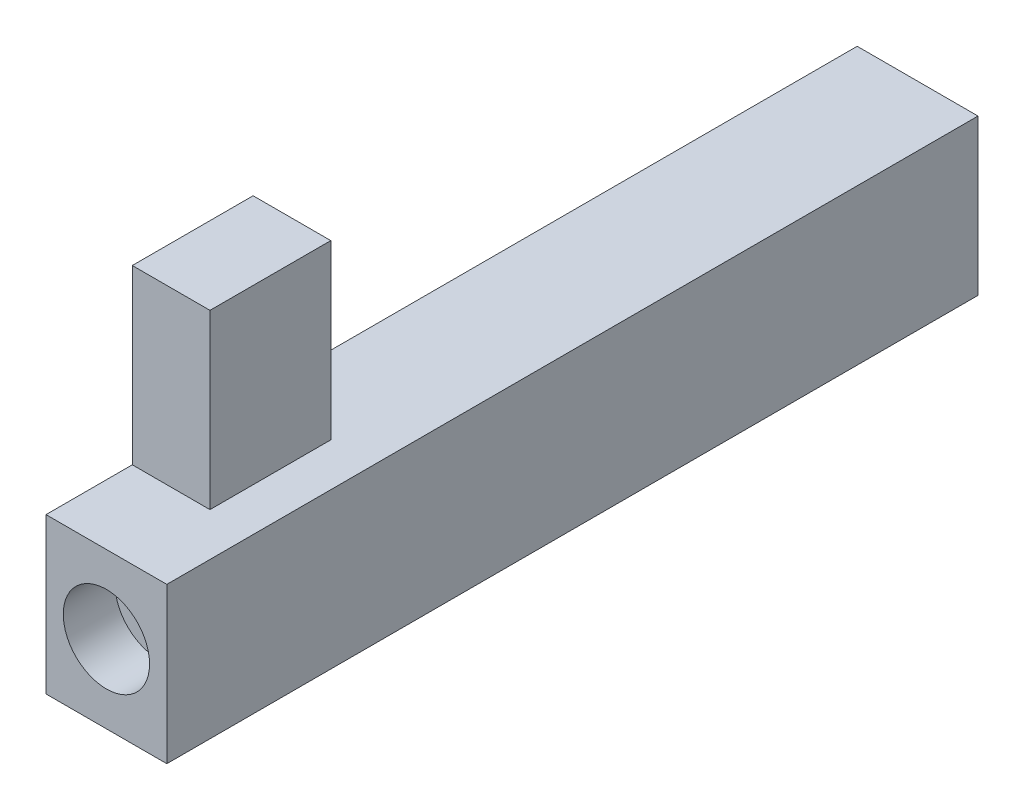
ISO-10303-21;
HEADER;
FILE_DESCRIPTION(('STEP AP214'),'2;1');
FILE_NAME('part.step','',(''),(''),'','','');
FILE_SCHEMA(('AUTOMOTIVE_DESIGN { 1 0 10303 214 1 1 1 1 }'));
ENDSEC;
DATA;
#1=APPLICATION_CONTEXT('core data for automotive mechanical design processes');
#2=APPLICATION_PROTOCOL_DEFINITION('international standard','automotive_design',2000,#1);
#3=PRODUCT_CONTEXT('',#1,'mechanical');
#4=PRODUCT('Part','Part','',(#3));
#5=PRODUCT_RELATED_PRODUCT_CATEGORY('part','',(#4));
#6=PRODUCT_DEFINITION_FORMATION('','',#4);
#7=PRODUCT_DEFINITION_CONTEXT('part definition',#1,'design');
#8=PRODUCT_DEFINITION('design','',#6,#7);
#9=PRODUCT_DEFINITION_SHAPE('','',#8);
#10=(LENGTH_UNIT() NAMED_UNIT(*) SI_UNIT(.MILLI.,.METRE.));
#11=(NAMED_UNIT(*) PLANE_ANGLE_UNIT() SI_UNIT($,.RADIAN.));
#12=(NAMED_UNIT(*) SI_UNIT($,.STERADIAN.) SOLID_ANGLE_UNIT());
#13=UNCERTAINTY_MEASURE_WITH_UNIT(LENGTH_MEASURE(1.E-05),#10,'distance_accuracy_value','');
#14=(GEOMETRIC_REPRESENTATION_CONTEXT(3) GLOBAL_UNCERTAINTY_ASSIGNED_CONTEXT((#13)) GLOBAL_UNIT_ASSIGNED_CONTEXT((#10,
#11,#12)) REPRESENTATION_CONTEXT('',''));
#15=CARTESIAN_POINT('',(0.,0.,0.));
#16=DIRECTION('',(0.,0.,1.));
#17=DIRECTION('',(1.,0.,0.));
#18=AXIS2_PLACEMENT_3D('',#15,#16,#17);
#19=CARTESIAN_POINT('',(3.5,4.5,-49.));
#20=DIRECTION('',(0.,0.,1.));
#21=DIRECTION('',(1.,0.,0.));
#22=AXIS2_PLACEMENT_3D('',#19,#20,#21);
#23=CYLINDRICAL_SURFACE('',#22,1.25);
#24=CARTESIAN_POINT('',(3.5,4.5,-47.));
#25=DIRECTION('',(0.,0.,1.));
#26=DIRECTION('',(1.,0.,0.));
#27=AXIS2_PLACEMENT_3D('',#24,#25,#26);
#28=CIRCLE('',#27,1.25);
#29=CARTESIAN_POINT('',(4.75,4.5,-47.));
#30=VERTEX_POINT('',#29);
#31=EDGE_CURVE('E152',#30,#30,#28,.T.);
#32=ORIENTED_EDGE('',*,*,#31,.F.);
#33=EDGE_LOOP('',(#32));
#34=FACE_BOUND('',#33,.T.);
#35=CARTESIAN_POINT('',(3.5,4.5,-3.00000000000001));
#36=DIRECTION('',(0.,0.,1.));
#37=DIRECTION('',(1.,0.,0.));
#38=AXIS2_PLACEMENT_3D('',#35,#36,#37);
#39=CIRCLE('',#38,1.25);
#40=CARTESIAN_POINT('',(4.75,4.5,-3.00000000000001));
#41=VERTEX_POINT('',#40);
#42=EDGE_CURVE('E39',#41,#41,#39,.F.);
#43=ORIENTED_EDGE('',*,*,#42,.F.);
#44=EDGE_LOOP('',(#43));
#45=FACE_BOUND('',#44,.T.);
#46=ADVANCED_FACE('F35',(#34,#45),#23,.F.);
#47=CARTESIAN_POINT('',(0.,9.,0.));
#48=DIRECTION('',(0.,-1.,0.));
#49=DIRECTION('',(0.,0.,-1.));
#50=AXIS2_PLACEMENT_3D('',#47,#48,#49);
#51=PLANE('',#50);
#52=DIRECTION('',(-1.,0.,0.));
#53=VECTOR('',#52,1.);
#54=CARTESIAN_POINT('',(0.,9.,-12.));
#55=LINE('',#54,#53);
#56=CARTESIAN_POINT('',(4.5,9.,-12.));
#57=VERTEX_POINT('',#56);
#58=CARTESIAN_POINT('',(0.,9.,-12.));
#59=VERTEX_POINT('',#58);
#60=EDGE_CURVE('E52',#57,#59,#55,.T.);
#61=ORIENTED_EDGE('',*,*,#60,.F.);
#62=DIRECTION('',(0.,0.,-1.));
#63=VECTOR('',#62,1.);
#64=CARTESIAN_POINT('',(4.5,9.,-12.));
#65=LINE('',#64,#63);
#66=CARTESIAN_POINT('',(4.5,9.,-5.));
#67=VERTEX_POINT('',#66);
#68=EDGE_CURVE('E156',#67,#57,#65,.T.);
#69=ORIENTED_EDGE('',*,*,#68,.F.);
#70=DIRECTION('',(1.,0.,0.));
#71=VECTOR('',#70,1.);
#72=CARTESIAN_POINT('',(0.,9.,-5.));
#73=LINE('',#72,#71);
#74=CARTESIAN_POINT('',(0.,9.,-5.));
#75=VERTEX_POINT('',#74);
#76=EDGE_CURVE('E58',#75,#67,#73,.T.);
#77=ORIENTED_EDGE('',*,*,#76,.F.);
#78=DIRECTION('',(0.,0.,1.));
#79=VECTOR('',#78,1.);
#80=CARTESIAN_POINT('',(0.,9.,0.));
#81=LINE('',#80,#79);
#82=CARTESIAN_POINT('',(0.,9.,0.));
#83=VERTEX_POINT('',#82);
#84=EDGE_CURVE('E123',#75,#83,#81,.T.);
#85=ORIENTED_EDGE('',*,*,#84,.T.);
#86=DIRECTION('',(1.,0.,0.));
#87=VECTOR('',#86,1.);
#88=CARTESIAN_POINT('',(0.,9.,0.));
#89=LINE('',#88,#87);
#90=CARTESIAN_POINT('',(7.,9.,0.));
#91=VERTEX_POINT('',#90);
#92=EDGE_CURVE('E134',#83,#91,#89,.T.);
#93=ORIENTED_EDGE('',*,*,#92,.T.);
#94=DIRECTION('',(0.,0.,-1.));
#95=VECTOR('',#94,1.);
#96=CARTESIAN_POINT('',(7.,9.,0.));
#97=LINE('',#96,#95);
#98=CARTESIAN_POINT('',(7.,9.,-47.));
#99=VERTEX_POINT('',#98);
#100=EDGE_CURVE('E136',#91,#99,#97,.T.);
#101=ORIENTED_EDGE('',*,*,#100,.T.);
#102=DIRECTION('',(-1.,0.,0.));
#103=VECTOR('',#102,1.);
#104=CARTESIAN_POINT('',(0.,9.,-47.));
#105=LINE('',#104,#103);
#106=CARTESIAN_POINT('',(0.,9.,-47.));
#107=VERTEX_POINT('',#106);
#108=EDGE_CURVE('E138',#99,#107,#105,.T.);
#109=ORIENTED_EDGE('',*,*,#108,.T.);
#110=EDGE_CURVE('E132',#107,#59,#81,.T.);
#111=ORIENTED_EDGE('',*,*,#110,.T.);
#112=EDGE_LOOP('',(#61,#69,#77,#85,#93,#101,#109,#111));
#113=FACE_BOUND('',#112,.T.);
#114=ADVANCED_FACE('F181',(#113),#51,.F.);
#115=CARTESIAN_POINT('',(0.,9.,0.));
#116=DIRECTION('',(1.,0.,0.));
#117=DIRECTION('',(0.,0.,-1.));
#118=AXIS2_PLACEMENT_3D('',#115,#116,#117);
#119=PLANE('',#118);
#120=DIRECTION('',(0.,0.,1.));
#121=VECTOR('',#120,1.);
#122=CARTESIAN_POINT('',(0.,0.,0.));
#123=LINE('',#122,#121);
#124=CARTESIAN_POINT('',(0.,0.,-47.));
#125=VERTEX_POINT('',#124);
#126=CARTESIAN_POINT('',(0.,0.,0.));
#127=VERTEX_POINT('',#126);
#128=EDGE_CURVE('E124',#125,#127,#123,.T.);
#129=ORIENTED_EDGE('',*,*,#128,.T.);
#130=DIRECTION('',(0.,-1.,0.));
#131=VECTOR('',#130,1.);
#132=CARTESIAN_POINT('',(0.,9.,0.));
#133=LINE('',#132,#131);
#134=EDGE_CURVE('E11',#83,#127,#133,.T.);
#135=ORIENTED_EDGE('',*,*,#134,.F.);
#136=ORIENTED_EDGE('',*,*,#84,.F.);
#137=DIRECTION('',(0.,-1.,0.));
#138=VECTOR('',#137,1.);
#139=CARTESIAN_POINT('',(0.,19.,-5.));
#140=LINE('',#139,#138);
#141=CARTESIAN_POINT('',(0.,19.,-5.));
#142=VERTEX_POINT('',#141);
#143=EDGE_CURVE('E105',#142,#75,#140,.T.);
#144=ORIENTED_EDGE('',*,*,#143,.F.);
#145=DIRECTION('',(0.,0.,1.));
#146=VECTOR('',#145,1.);
#147=CARTESIAN_POINT('',(0.,19.,-12.));
#148=LINE('',#147,#146);
#149=CARTESIAN_POINT('',(0.,19.,-12.));
#150=VERTEX_POINT('',#149);
#151=EDGE_CURVE('E111',#150,#142,#148,.T.);
#152=ORIENTED_EDGE('',*,*,#151,.F.);
#153=DIRECTION('',(0.,-1.,0.));
#154=VECTOR('',#153,1.);
#155=CARTESIAN_POINT('',(0.,19.,-12.));
#156=LINE('',#155,#154);
#157=EDGE_CURVE('E171',#150,#59,#156,.T.);
#158=ORIENTED_EDGE('',*,*,#157,.T.);
#159=ORIENTED_EDGE('',*,*,#110,.F.);
#160=DIRECTION('',(0.,-1.,0.));
#161=VECTOR('',#160,1.);
#162=CARTESIAN_POINT('',(0.,9.,-47.));
#163=LINE('',#162,#161);
#164=EDGE_CURVE('E139',#107,#125,#163,.T.);
#165=ORIENTED_EDGE('',*,*,#164,.T.);
#166=EDGE_LOOP('',(#129,#135,#136,#144,#152,#158,#159,#165));
#167=FACE_BOUND('',#166,.T.);
#168=ADVANCED_FACE('F37',(#167),#119,.F.);
#169=CARTESIAN_POINT('',(0.,9.,0.));
#170=DIRECTION('',(0.,0.,-1.));
#171=DIRECTION('',(-1.,0.,0.));
#172=AXIS2_PLACEMENT_3D('',#169,#170,#171);
#173=PLANE('',#172);
#174=CARTESIAN_POINT('',(3.5,4.5,0.));
#175=DIRECTION('',(0.,0.,1.));
#176=DIRECTION('',(1.,0.,0.));
#177=AXIS2_PLACEMENT_3D('',#174,#175,#176);
#178=CIRCLE('',#177,2.5);
#179=CARTESIAN_POINT('',(6.,4.5,0.));
#180=VERTEX_POINT('',#179);
#181=EDGE_CURVE('E163',#180,#180,#178,.T.);
#182=ORIENTED_EDGE('',*,*,#181,.F.);
#183=EDGE_LOOP('',(#182));
#184=FACE_BOUND('',#183,.T.);
#185=DIRECTION('',(1.,0.,0.));
#186=VECTOR('',#185,1.);
#187=CARTESIAN_POINT('',(0.,0.,0.));
#188=LINE('',#187,#186);
#189=CARTESIAN_POINT('',(7.,0.,0.));
#190=VERTEX_POINT('',#189);
#191=EDGE_CURVE('E126',#127,#190,#188,.T.);
#192=ORIENTED_EDGE('',*,*,#191,.T.);
#193=DIRECTION('',(0.,-1.,0.));
#194=VECTOR('',#193,1.);
#195=CARTESIAN_POINT('',(7.,9.,0.));
#196=LINE('',#195,#194);
#197=EDGE_CURVE('E44',#91,#190,#196,.T.);
#198=ORIENTED_EDGE('',*,*,#197,.F.);
#199=ORIENTED_EDGE('',*,*,#92,.F.);
#200=ORIENTED_EDGE('',*,*,#134,.T.);
#201=EDGE_LOOP('',(#192,#198,#199,#200));
#202=FACE_BOUND('',#201,.T.);
#203=ADVANCED_FACE('F188',(#184,#202),#173,.F.);
#204=CARTESIAN_POINT('',(7.,9.,0.));
#205=DIRECTION('',(-1.,0.,0.));
#206=DIRECTION('',(0.,0.,1.));
#207=AXIS2_PLACEMENT_3D('',#204,#205,#206);
#208=PLANE('',#207);
#209=DIRECTION('',(0.,0.,-1.));
#210=VECTOR('',#209,1.);
#211=CARTESIAN_POINT('',(7.,0.,0.));
#212=LINE('',#211,#210);
#213=CARTESIAN_POINT('',(7.,0.,-47.));
#214=VERTEX_POINT('',#213);
#215=EDGE_CURVE('E142',#190,#214,#212,.T.);
#216=ORIENTED_EDGE('',*,*,#215,.T.);
#217=DIRECTION('',(0.,-1.,0.));
#218=VECTOR('',#217,1.);
#219=CARTESIAN_POINT('',(7.,9.,-47.));
#220=LINE('',#219,#218);
#221=EDGE_CURVE('E148',#99,#214,#220,.T.);
#222=ORIENTED_EDGE('',*,*,#221,.F.);
#223=ORIENTED_EDGE('',*,*,#100,.F.);
#224=ORIENTED_EDGE('',*,*,#197,.T.);
#225=EDGE_LOOP('',(#216,#222,#223,#224));
#226=FACE_BOUND('',#225,.T.);
#227=ADVANCED_FACE('F201',(#226),#208,.F.);
#228=CARTESIAN_POINT('',(0.,9.,-47.));
#229=DIRECTION('',(0.,0.,1.));
#230=DIRECTION('',(1.,0.,0.));
#231=AXIS2_PLACEMENT_3D('',#228,#229,#230);
#232=PLANE('',#231);
#233=ORIENTED_EDGE('',*,*,#31,.T.);
#234=EDGE_LOOP('',(#233));
#235=FACE_BOUND('',#234,.T.);
#236=DIRECTION('',(-1.,0.,0.));
#237=VECTOR('',#236,1.);
#238=CARTESIAN_POINT('',(0.,0.,-47.));
#239=LINE('',#238,#237);
#240=EDGE_CURVE('E144',#214,#125,#239,.T.);
#241=ORIENTED_EDGE('',*,*,#240,.T.);
#242=ORIENTED_EDGE('',*,*,#164,.F.);
#243=ORIENTED_EDGE('',*,*,#108,.F.);
#244=ORIENTED_EDGE('',*,*,#221,.T.);
#245=EDGE_LOOP('',(#241,#242,#243,#244));
#246=FACE_BOUND('',#245,.T.);
#247=ADVANCED_FACE('F197',(#235,#246),#232,.F.);
#248=CARTESIAN_POINT('',(0.,0.,0.));
#249=DIRECTION('',(0.,-1.,0.));
#250=DIRECTION('',(0.,0.,-1.));
#251=AXIS2_PLACEMENT_3D('',#248,#249,#250);
#252=PLANE('',#251);
#253=ORIENTED_EDGE('',*,*,#128,.F.);
#254=ORIENTED_EDGE('',*,*,#240,.F.);
#255=ORIENTED_EDGE('',*,*,#215,.F.);
#256=ORIENTED_EDGE('',*,*,#191,.F.);
#257=EDGE_LOOP('',(#253,#254,#255,#256));
#258=FACE_BOUND('',#257,.T.);
#259=ADVANCED_FACE('F194',(#258),#252,.T.);
#260=CARTESIAN_POINT('',(0.,19.,-5.));
#261=DIRECTION('',(0.,0.,-1.));
#262=DIRECTION('',(-1.,0.,0.));
#263=AXIS2_PLACEMENT_3D('',#260,#261,#262);
#264=PLANE('',#263);
#265=ORIENTED_EDGE('',*,*,#76,.T.);
#266=DIRECTION('',(0.,-1.,0.));
#267=VECTOR('',#266,1.);
#268=CARTESIAN_POINT('',(4.5,19.,-5.));
#269=LINE('',#268,#267);
#270=CARTESIAN_POINT('',(4.5,19.,-5.));
#271=VERTEX_POINT('',#270);
#272=EDGE_CURVE('E107',#271,#67,#269,.T.);
#273=ORIENTED_EDGE('',*,*,#272,.F.);
#274=DIRECTION('',(1.,0.,0.));
#275=VECTOR('',#274,1.);
#276=CARTESIAN_POINT('',(0.,19.,-5.));
#277=LINE('',#276,#275);
#278=EDGE_CURVE('E101',#142,#271,#277,.T.);
#279=ORIENTED_EDGE('',*,*,#278,.F.);
#280=ORIENTED_EDGE('',*,*,#143,.T.);
#281=EDGE_LOOP('',(#265,#273,#279,#280));
#282=FACE_BOUND('',#281,.T.);
#283=ADVANCED_FACE('F103',(#282),#264,.F.);
#284=CARTESIAN_POINT('',(4.5,19.,-12.));
#285=DIRECTION('',(-1.,0.,0.));
#286=DIRECTION('',(0.,0.,1.));
#287=AXIS2_PLACEMENT_3D('',#284,#285,#286);
#288=PLANE('',#287);
#289=ORIENTED_EDGE('',*,*,#68,.T.);
#290=DIRECTION('',(0.,-1.,0.));
#291=VECTOR('',#290,1.);
#292=CARTESIAN_POINT('',(4.5,19.,-12.));
#293=LINE('',#292,#291);
#294=CARTESIAN_POINT('',(4.5,19.,-12.));
#295=VERTEX_POINT('',#294);
#296=EDGE_CURVE('E128',#295,#57,#293,.T.);
#297=ORIENTED_EDGE('',*,*,#296,.F.);
#298=DIRECTION('',(0.,0.,-1.));
#299=VECTOR('',#298,1.);
#300=CARTESIAN_POINT('',(4.5,19.,-12.));
#301=LINE('',#300,#299);
#302=EDGE_CURVE('E110',#271,#295,#301,.T.);
#303=ORIENTED_EDGE('',*,*,#302,.F.);
#304=ORIENTED_EDGE('',*,*,#272,.T.);
#305=EDGE_LOOP('',(#289,#297,#303,#304));
#306=FACE_BOUND('',#305,.T.);
#307=ADVANCED_FACE('F180',(#306),#288,.F.);
#308=CARTESIAN_POINT('',(0.,19.,-12.));
#309=DIRECTION('',(0.,0.,1.));
#310=DIRECTION('',(1.,0.,0.));
#311=AXIS2_PLACEMENT_3D('',#308,#309,#310);
#312=PLANE('',#311);
#313=ORIENTED_EDGE('',*,*,#60,.T.);
#314=ORIENTED_EDGE('',*,*,#157,.F.);
#315=DIRECTION('',(-1.,0.,0.));
#316=VECTOR('',#315,1.);
#317=CARTESIAN_POINT('',(0.,19.,-12.));
#318=LINE('',#317,#316);
#319=EDGE_CURVE('E116',#295,#150,#318,.T.);
#320=ORIENTED_EDGE('',*,*,#319,.F.);
#321=ORIENTED_EDGE('',*,*,#296,.T.);
#322=EDGE_LOOP('',(#313,#314,#320,#321));
#323=FACE_BOUND('',#322,.T.);
#324=ADVANCED_FACE('F178',(#323),#312,.F.);
#325=CARTESIAN_POINT('',(0.,19.,0.));
#326=DIRECTION('',(0.,1.,0.));
#327=DIRECTION('',(0.,0.,1.));
#328=AXIS2_PLACEMENT_3D('',#325,#326,#327);
#329=PLANE('',#328);
#330=ORIENTED_EDGE('',*,*,#151,.T.);
#331=ORIENTED_EDGE('',*,*,#278,.T.);
#332=ORIENTED_EDGE('',*,*,#302,.T.);
#333=ORIENTED_EDGE('',*,*,#319,.T.);
#334=EDGE_LOOP('',(#330,#331,#332,#333));
#335=FACE_BOUND('',#334,.T.);
#336=ADVANCED_FACE('F114',(#335),#329,.T.);
#337=CARTESIAN_POINT('',(3.5,4.5,-3.00000000000001));
#338=DIRECTION('',(0.,0.,1.));
#339=DIRECTION('',(1.,0.,0.));
#340=AXIS2_PLACEMENT_3D('',#337,#338,#339);
#341=PLANE('',#340);
#342=CARTESIAN_POINT('',(3.5,4.5,-3.00000000000001));
#343=DIRECTION('',(0.,0.,1.));
#344=DIRECTION('',(1.,0.,0.));
#345=AXIS2_PLACEMENT_3D('',#342,#343,#344);
#346=CIRCLE('',#345,2.5);
#347=CARTESIAN_POINT('',(6.,4.5,-3.00000000000001));
#348=VERTEX_POINT('',#347);
#349=EDGE_CURVE('E159',#348,#348,#346,.T.);
#350=ORIENTED_EDGE('',*,*,#349,.T.);
#351=EDGE_LOOP('',(#350));
#352=FACE_BOUND('',#351,.T.);
#353=ORIENTED_EDGE('',*,*,#42,.T.);
#354=EDGE_LOOP('',(#353));
#355=FACE_BOUND('',#354,.T.);
#356=ADVANCED_FACE('F224',(#352,#355),#341,.T.);
#357=CARTESIAN_POINT('',(3.5,4.5,-3.00000000000001));
#358=DIRECTION('',(0.,0.,1.));
#359=DIRECTION('',(1.,0.,0.));
#360=AXIS2_PLACEMENT_3D('',#357,#358,#359);
#361=CYLINDRICAL_SURFACE('',#360,2.5);
#362=ORIENTED_EDGE('',*,*,#349,.F.);
#363=EDGE_LOOP('',(#362));
#364=FACE_BOUND('',#363,.T.);
#365=ORIENTED_EDGE('',*,*,#181,.T.);
#366=EDGE_LOOP('',(#365));
#367=FACE_BOUND('',#366,.T.);
#368=ADVANCED_FACE('F222',(#364,#367),#361,.F.);
#369=CLOSED_SHELL('',(#46,#114,#168,#203,#227,#247,#259,#283,#307,#324,#336,#356,#368));
#370=MANIFOLD_SOLID_BREP('B2',#369);
#371=ADVANCED_BREP_SHAPE_REPRESENTATION('',(#18,#370),#14);
#372=SHAPE_DEFINITION_REPRESENTATION(#9,#371);
ENDSEC;
END-ISO-10303-21;
